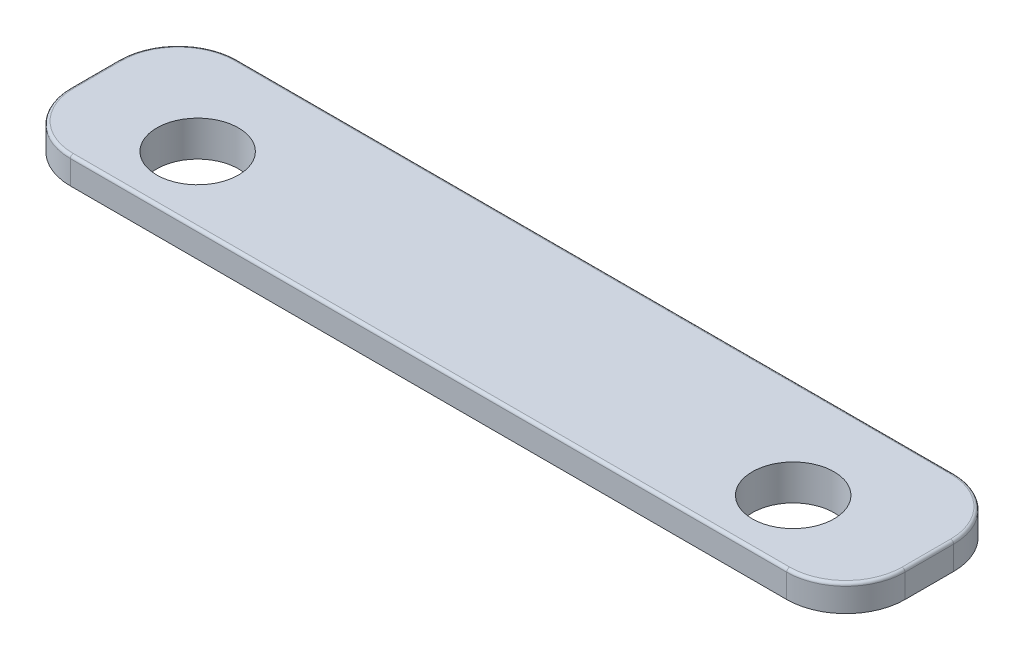
ISO-10303-21;
HEADER;
FILE_DESCRIPTION(('STEP AP214'),'2;1');
FILE_NAME('part.step','',(''),(''),'','','');
FILE_SCHEMA(('AUTOMOTIVE_DESIGN { 1 0 10303 214 1 1 1 1 }'));
ENDSEC;
DATA;
#1=APPLICATION_CONTEXT('core data for automotive mechanical design processes');
#2=APPLICATION_PROTOCOL_DEFINITION('international standard','automotive_design',2000,#1);
#3=PRODUCT_CONTEXT('',#1,'mechanical');
#4=PRODUCT('Part','Part','',(#3));
#5=PRODUCT_RELATED_PRODUCT_CATEGORY('part','',(#4));
#6=PRODUCT_DEFINITION_FORMATION('','',#4);
#7=PRODUCT_DEFINITION_CONTEXT('part definition',#1,'design');
#8=PRODUCT_DEFINITION('design','',#6,#7);
#9=PRODUCT_DEFINITION_SHAPE('','',#8);
#10=(LENGTH_UNIT() NAMED_UNIT(*) SI_UNIT(.MILLI.,.METRE.));
#11=(NAMED_UNIT(*) PLANE_ANGLE_UNIT() SI_UNIT($,.RADIAN.));
#12=(NAMED_UNIT(*) SI_UNIT($,.STERADIAN.) SOLID_ANGLE_UNIT());
#13=UNCERTAINTY_MEASURE_WITH_UNIT(LENGTH_MEASURE(1.E-05),#10,'distance_accuracy_value','');
#14=(GEOMETRIC_REPRESENTATION_CONTEXT(3) GLOBAL_UNCERTAINTY_ASSIGNED_CONTEXT((#13)) GLOBAL_UNIT_ASSIGNED_CONTEXT((#10,
#11,#12)) REPRESENTATION_CONTEXT('',''));
#15=CARTESIAN_POINT('',(0.,0.,0.));
#16=DIRECTION('',(0.,0.,1.));
#17=DIRECTION('',(1.,0.,0.));
#18=AXIS2_PLACEMENT_3D('',#15,#16,#17);
#19=CARTESIAN_POINT('',(-17.907,1.524,-3.5814));
#20=DIRECTION('',(1.,0.,0.));
#21=DIRECTION('',(0.,0.,-1.));
#22=AXIS2_PLACEMENT_3D('',#19,#20,#21);
#23=PLANE('',#22);
#24=DIRECTION('',(0.,0.,-1.));
#25=VECTOR('',#24,1.);
#26=CARTESIAN_POINT('',(-17.907,0.381,-1.0414));
#27=LINE('',#26,#25);
#28=CARTESIAN_POINT('',(-17.907,0.381,1.0414));
#29=VERTEX_POINT('',#28);
#30=CARTESIAN_POINT('',(-17.907,0.381,-1.0414));
#31=VERTEX_POINT('',#30);
#32=EDGE_CURVE('E254',#29,#31,#27,.T.);
#33=ORIENTED_EDGE('',*,*,#32,.F.);
#34=DIRECTION('',(0.,-1.,0.));
#35=VECTOR('',#34,1.);
#36=CARTESIAN_POINT('',(-17.907,1.524,1.0414));
#37=LINE('',#36,#35);
#38=CARTESIAN_POINT('',(-17.907,1.397,1.0414));
#39=VERTEX_POINT('',#38);
#40=EDGE_CURVE('E270',#29,#39,#37,.F.);
#41=ORIENTED_EDGE('',*,*,#40,.T.);
#42=DIRECTION('',(0.,0.,1.));
#43=VECTOR('',#42,1.);
#44=CARTESIAN_POINT('',(-17.907,1.397,-1.0414));
#45=LINE('',#44,#43);
#46=CARTESIAN_POINT('',(-17.907,1.397,-1.0414));
#47=VERTEX_POINT('',#46);
#48=EDGE_CURVE('E316',#39,#47,#45,.F.);
#49=ORIENTED_EDGE('',*,*,#48,.T.);
#50=DIRECTION('',(0.,-1.,0.));
#51=VECTOR('',#50,1.);
#52=CARTESIAN_POINT('',(-17.907,1.524,-1.0414));
#53=LINE('',#52,#51);
#54=EDGE_CURVE('E272',#47,#31,#53,.T.);
#55=ORIENTED_EDGE('',*,*,#54,.T.);
#56=EDGE_LOOP('',(#33,#41,#49,#55));
#57=FACE_BOUND('',#56,.T.);
#58=ADVANCED_FACE('F34',(#57),#23,.F.);
#59=CARTESIAN_POINT('',(-17.907,1.524,3.5814));
#60=DIRECTION('',(0.,0.,-1.));
#61=DIRECTION('',(-1.,0.,0.));
#62=AXIS2_PLACEMENT_3D('',#59,#60,#61);
#63=PLANE('',#62);
#64=DIRECTION('',(-1.,0.,0.));
#65=VECTOR('',#64,1.);
#66=CARTESIAN_POINT('',(-15.367,0.381,3.5814));
#67=LINE('',#66,#65);
#68=CARTESIAN_POINT('',(15.367,0.381,3.5814));
#69=VERTEX_POINT('',#68);
#70=CARTESIAN_POINT('',(-15.367,0.381,3.5814));
#71=VERTEX_POINT('',#70);
#72=EDGE_CURVE('E250',#69,#71,#67,.T.);
#73=ORIENTED_EDGE('',*,*,#72,.F.);
#74=DIRECTION('',(0.,-1.,0.));
#75=VECTOR('',#74,1.);
#76=CARTESIAN_POINT('',(15.367,1.524,3.5814));
#77=LINE('',#76,#75);
#78=CARTESIAN_POINT('',(15.367,1.397,3.5814));
#79=VERTEX_POINT('',#78);
#80=EDGE_CURVE('E281',#69,#79,#77,.F.);
#81=ORIENTED_EDGE('',*,*,#80,.T.);
#82=DIRECTION('',(1.,0.,0.));
#83=VECTOR('',#82,1.);
#84=CARTESIAN_POINT('',(-15.367,1.397,3.5814));
#85=LINE('',#84,#83);
#86=CARTESIAN_POINT('',(-15.367,1.397,3.5814));
#87=VERTEX_POINT('',#86);
#88=EDGE_CURVE('E311',#79,#87,#85,.F.);
#89=ORIENTED_EDGE('',*,*,#88,.T.);
#90=DIRECTION('',(0.,-1.,0.));
#91=VECTOR('',#90,1.);
#92=CARTESIAN_POINT('',(-15.367,1.524,3.5814));
#93=LINE('',#92,#91);
#94=EDGE_CURVE('E283',#87,#71,#93,.T.);
#95=ORIENTED_EDGE('',*,*,#94,.T.);
#96=EDGE_LOOP('',(#73,#81,#89,#95));
#97=FACE_BOUND('',#96,.T.);
#98=ADVANCED_FACE('F400',(#97),#63,.F.);
#99=CARTESIAN_POINT('',(17.907,1.524,-3.5814));
#100=DIRECTION('',(-1.,0.,0.));
#101=DIRECTION('',(0.,0.,1.));
#102=AXIS2_PLACEMENT_3D('',#99,#100,#101);
#103=PLANE('',#102);
#104=DIRECTION('',(0.,0.,1.));
#105=VECTOR('',#104,1.);
#106=CARTESIAN_POINT('',(17.907,0.381,1.0414));
#107=LINE('',#106,#105);
#108=CARTESIAN_POINT('',(17.907,0.381,-1.0414));
#109=VERTEX_POINT('',#108);
#110=CARTESIAN_POINT('',(17.907,0.381,1.0414));
#111=VERTEX_POINT('',#110);
#112=EDGE_CURVE('E59',#109,#111,#107,.T.);
#113=ORIENTED_EDGE('',*,*,#112,.F.);
#114=DIRECTION('',(0.,-1.,0.));
#115=VECTOR('',#114,1.);
#116=CARTESIAN_POINT('',(17.907,1.524,-1.0414));
#117=LINE('',#116,#115);
#118=CARTESIAN_POINT('',(17.907,1.397,-1.0414));
#119=VERTEX_POINT('',#118);
#120=EDGE_CURVE('E289',#109,#119,#117,.F.);
#121=ORIENTED_EDGE('',*,*,#120,.T.);
#122=DIRECTION('',(0.,0.,-1.));
#123=VECTOR('',#122,1.);
#124=CARTESIAN_POINT('',(17.907,1.397,1.0414));
#125=LINE('',#124,#123);
#126=CARTESIAN_POINT('',(17.907,1.397,1.0414));
#127=VERTEX_POINT('',#126);
#128=EDGE_CURVE('E11',#119,#127,#125,.F.);
#129=ORIENTED_EDGE('',*,*,#128,.T.);
#130=DIRECTION('',(0.,-1.,0.));
#131=VECTOR('',#130,1.);
#132=CARTESIAN_POINT('',(17.907,1.524,1.0414));
#133=LINE('',#132,#131);
#134=EDGE_CURVE('E286',#127,#111,#133,.T.);
#135=ORIENTED_EDGE('',*,*,#134,.T.);
#136=EDGE_LOOP('',(#113,#121,#129,#135));
#137=FACE_BOUND('',#136,.T.);
#138=ADVANCED_FACE('F412',(#137),#103,.F.);
#139=CARTESIAN_POINT('',(-17.907,1.524,-3.5814));
#140=DIRECTION('',(0.,0.,1.));
#141=DIRECTION('',(1.,0.,0.));
#142=AXIS2_PLACEMENT_3D('',#139,#140,#141);
#143=PLANE('',#142);
#144=DIRECTION('',(1.,0.,0.));
#145=VECTOR('',#144,1.);
#146=CARTESIAN_POINT('',(15.367,0.381,-3.5814));
#147=LINE('',#146,#145);
#148=CARTESIAN_POINT('',(-15.367,0.381,-3.5814));
#149=VERTEX_POINT('',#148);
#150=CARTESIAN_POINT('',(15.367,0.381,-3.5814));
#151=VERTEX_POINT('',#150);
#152=EDGE_CURVE('E258',#149,#151,#147,.T.);
#153=ORIENTED_EDGE('',*,*,#152,.F.);
#154=DIRECTION('',(0.,-1.,0.));
#155=VECTOR('',#154,1.);
#156=CARTESIAN_POINT('',(-15.367,1.524,-3.5814));
#157=LINE('',#156,#155);
#158=CARTESIAN_POINT('',(-15.367,1.397,-3.5814));
#159=VERTEX_POINT('',#158);
#160=EDGE_CURVE('E279',#149,#159,#157,.F.);
#161=ORIENTED_EDGE('',*,*,#160,.T.);
#162=DIRECTION('',(-1.,0.,0.));
#163=VECTOR('',#162,1.);
#164=CARTESIAN_POINT('',(15.367,1.397,-3.5814));
#165=LINE('',#164,#163);
#166=CARTESIAN_POINT('',(15.367,1.397,-3.5814));
#167=VERTEX_POINT('',#166);
#168=EDGE_CURVE('E321',#159,#167,#165,.F.);
#169=ORIENTED_EDGE('',*,*,#168,.T.);
#170=DIRECTION('',(0.,-1.,0.));
#171=VECTOR('',#170,1.);
#172=CARTESIAN_POINT('',(15.367,1.524,-3.5814));
#173=LINE('',#172,#171);
#174=EDGE_CURVE('E276',#167,#151,#173,.T.);
#175=ORIENTED_EDGE('',*,*,#174,.T.);
#176=EDGE_LOOP('',(#153,#161,#169,#175));
#177=FACE_BOUND('',#176,.T.);
#178=ADVANCED_FACE('F397',(#177),#143,.F.);
#179=CARTESIAN_POINT('',(0.,0.,0.));
#180=DIRECTION('',(0.,1.,0.));
#181=DIRECTION('',(0.,0.,1.));
#182=AXIS2_PLACEMENT_3D('',#179,#180,#181);
#183=PLANE('',#182);
#184=CARTESIAN_POINT('',(0.,0.,0.711199999999999));
#185=DIRECTION('',(0.,-1.,0.));
#186=DIRECTION('',(0.,0.,-1.));
#187=AXIS2_PLACEMENT_3D('',#184,#185,#186);
#188=CIRCLE('',#187,0.381);
#189=CARTESIAN_POINT('',(0.,0.,0.330199999999999));
#190=VERTEX_POINT('',#189);
#191=EDGE_CURVE('E732',#190,#190,#188,.T.);
#192=ORIENTED_EDGE('',*,*,#191,.F.);
#193=EDGE_LOOP('',(#192));
#194=FACE_BOUND('',#193,.T.);
#195=CARTESIAN_POINT('',(12.7762,0.,0.711199999999999));
#196=DIRECTION('',(0.,1.,0.));
#197=DIRECTION('',(0.,0.,1.));
#198=AXIS2_PLACEMENT_3D('',#195,#196,#197);
#199=CIRCLE('',#198,1.7526);
#200=CARTESIAN_POINT('',(12.7762,0.,2.4638));
#201=VERTEX_POINT('',#200);
#202=EDGE_CURVE('E737',#201,#201,#199,.T.);
#203=ORIENTED_EDGE('',*,*,#202,.T.);
#204=EDGE_LOOP('',(#203));
#205=FACE_BOUND('',#204,.T.);
#206=CARTESIAN_POINT('',(-12.7762,0.,0.711199999999999));
#207=DIRECTION('',(0.,1.,0.));
#208=DIRECTION('',(0.,0.,1.));
#209=AXIS2_PLACEMENT_3D('',#206,#207,#208);
#210=CIRCLE('',#209,1.7526);
#211=CARTESIAN_POINT('',(-12.7762,0.,2.4638));
#212=VERTEX_POINT('',#211);
#213=EDGE_CURVE('E204',#212,#212,#210,.T.);
#214=ORIENTED_EDGE('',*,*,#213,.T.);
#215=EDGE_LOOP('',(#214));
#216=FACE_BOUND('',#215,.T.);
#217=CARTESIAN_POINT('',(-15.367,0.,1.0414));
#218=DIRECTION('',(0.,-1.,0.));
#219=DIRECTION('',(0.,0.,-1.));
#220=AXIS2_PLACEMENT_3D('',#217,#218,#219);
#221=CIRCLE('',#220,1.905);
#222=CARTESIAN_POINT('',(-15.367,0.,2.9464));
#223=VERTEX_POINT('',#222);
#224=CARTESIAN_POINT('',(-17.272,0.,1.0414));
#225=VERTEX_POINT('',#224);
#226=EDGE_CURVE('E221',#223,#225,#221,.T.);
#227=ORIENTED_EDGE('',*,*,#226,.T.);
#228=DIRECTION('',(0.,0.,-1.));
#229=VECTOR('',#228,1.);
#230=CARTESIAN_POINT('',(-17.272,0.,-1.0414));
#231=LINE('',#230,#229);
#232=CARTESIAN_POINT('',(-17.272,0.,-1.0414));
#233=VERTEX_POINT('',#232);
#234=EDGE_CURVE('E178',#225,#233,#231,.T.);
#235=ORIENTED_EDGE('',*,*,#234,.T.);
#236=CARTESIAN_POINT('',(-15.367,0.,-1.0414));
#237=DIRECTION('',(0.,-1.,0.));
#238=DIRECTION('',(0.,0.,-1.));
#239=AXIS2_PLACEMENT_3D('',#236,#237,#238);
#240=CIRCLE('',#239,1.905);
#241=CARTESIAN_POINT('',(-15.367,0.,-2.9464));
#242=VERTEX_POINT('',#241);
#243=EDGE_CURVE('E51',#233,#242,#240,.T.);
#244=ORIENTED_EDGE('',*,*,#243,.T.);
#245=DIRECTION('',(1.,0.,0.));
#246=VECTOR('',#245,1.);
#247=CARTESIAN_POINT('',(15.367,0.,-2.9464));
#248=LINE('',#247,#246);
#249=CARTESIAN_POINT('',(15.367,0.,-2.9464));
#250=VERTEX_POINT('',#249);
#251=EDGE_CURVE('E225',#242,#250,#248,.T.);
#252=ORIENTED_EDGE('',*,*,#251,.T.);
#253=CARTESIAN_POINT('',(15.367,0.,-1.0414));
#254=DIRECTION('',(0.,-1.,0.));
#255=DIRECTION('',(0.,0.,-1.));
#256=AXIS2_PLACEMENT_3D('',#253,#254,#255);
#257=CIRCLE('',#256,1.905);
#258=CARTESIAN_POINT('',(17.272,0.,-1.0414));
#259=VERTEX_POINT('',#258);
#260=EDGE_CURVE('E228',#250,#259,#257,.T.);
#261=ORIENTED_EDGE('',*,*,#260,.T.);
#262=DIRECTION('',(0.,0.,1.));
#263=VECTOR('',#262,1.);
#264=CARTESIAN_POINT('',(17.272,0.,1.0414));
#265=LINE('',#264,#263);
#266=CARTESIAN_POINT('',(17.272,0.,1.0414));
#267=VERTEX_POINT('',#266);
#268=EDGE_CURVE('E231',#259,#267,#265,.T.);
#269=ORIENTED_EDGE('',*,*,#268,.T.);
#270=CARTESIAN_POINT('',(15.367,0.,1.0414));
#271=DIRECTION('',(0.,-1.,0.));
#272=DIRECTION('',(0.,0.,-1.));
#273=AXIS2_PLACEMENT_3D('',#270,#271,#272);
#274=CIRCLE('',#273,1.905);
#275=CARTESIAN_POINT('',(15.367,0.,2.9464));
#276=VERTEX_POINT('',#275);
#277=EDGE_CURVE('E201',#267,#276,#274,.T.);
#278=ORIENTED_EDGE('',*,*,#277,.T.);
#279=DIRECTION('',(-1.,0.,0.));
#280=VECTOR('',#279,1.);
#281=CARTESIAN_POINT('',(-15.367,0.,2.9464));
#282=LINE('',#281,#280);
#283=EDGE_CURVE('E198',#276,#223,#282,.T.);
#284=ORIENTED_EDGE('',*,*,#283,.T.);
#285=EDGE_LOOP('',(#227,#235,#244,#252,#261,#269,#278,#284));
#286=FACE_BOUND('',#285,.T.);
#287=ADVANCED_FACE('F434',(#194,#205,#216,#286),#183,.F.);
#288=CARTESIAN_POINT('',(-15.367,1.524,-1.0414));
#289=DIRECTION('',(0.,-1.,0.));
#290=DIRECTION('',(0.,0.,-1.));
#291=AXIS2_PLACEMENT_3D('',#288,#289,#290);
#292=CYLINDRICAL_SURFACE('',#291,2.54);
#293=ORIENTED_EDGE('',*,*,#160,.F.);
#294=CARTESIAN_POINT('',(-15.367,0.381,-1.0414));
#295=DIRECTION('',(0.,-1.,0.));
#296=DIRECTION('',(0.,0.,-1.));
#297=AXIS2_PLACEMENT_3D('',#294,#295,#296);
#298=CIRCLE('',#297,2.54);
#299=EDGE_CURVE('E256',#31,#149,#298,.T.);
#300=ORIENTED_EDGE('',*,*,#299,.F.);
#301=ORIENTED_EDGE('',*,*,#54,.F.);
#302=CARTESIAN_POINT('',(-15.367,1.397,-1.0414));
#303=DIRECTION('',(0.,1.,0.));
#304=DIRECTION('',(0.,0.,1.));
#305=AXIS2_PLACEMENT_3D('',#302,#303,#304);
#306=CIRCLE('',#305,2.54);
#307=EDGE_CURVE('E318',#47,#159,#306,.F.);
#308=ORIENTED_EDGE('',*,*,#307,.T.);
#309=EDGE_LOOP('',(#293,#300,#301,#308));
#310=FACE_BOUND('',#309,.T.);
#311=ADVANCED_FACE('F358',(#310),#292,.T.);
#312=CARTESIAN_POINT('',(-15.367,1.524,1.0414));
#313=DIRECTION('',(0.,-1.,0.));
#314=DIRECTION('',(0.,0.,-1.));
#315=AXIS2_PLACEMENT_3D('',#312,#313,#314);
#316=CYLINDRICAL_SURFACE('',#315,2.54);
#317=ORIENTED_EDGE('',*,*,#40,.F.);
#318=CARTESIAN_POINT('',(-15.367,0.381,1.0414));
#319=DIRECTION('',(0.,-1.,0.));
#320=DIRECTION('',(0.,0.,-1.));
#321=AXIS2_PLACEMENT_3D('',#318,#319,#320);
#322=CIRCLE('',#321,2.54);
#323=EDGE_CURVE('E252',#71,#29,#322,.T.);
#324=ORIENTED_EDGE('',*,*,#323,.F.);
#325=ORIENTED_EDGE('',*,*,#94,.F.);
#326=CARTESIAN_POINT('',(-15.367,1.397,1.0414));
#327=DIRECTION('',(0.,1.,0.));
#328=DIRECTION('',(0.,0.,1.));
#329=AXIS2_PLACEMENT_3D('',#326,#327,#328);
#330=CIRCLE('',#329,2.54);
#331=EDGE_CURVE('E313',#87,#39,#330,.F.);
#332=ORIENTED_EDGE('',*,*,#331,.T.);
#333=EDGE_LOOP('',(#317,#324,#325,#332));
#334=FACE_BOUND('',#333,.T.);
#335=ADVANCED_FACE('F367',(#334),#316,.T.);
#336=CARTESIAN_POINT('',(15.367,1.524,-1.0414));
#337=DIRECTION('',(0.,-1.,0.));
#338=DIRECTION('',(0.,0.,-1.));
#339=AXIS2_PLACEMENT_3D('',#336,#337,#338);
#340=CYLINDRICAL_SURFACE('',#339,2.54);
#341=ORIENTED_EDGE('',*,*,#120,.F.);
#342=CARTESIAN_POINT('',(15.367,0.381,-1.0414));
#343=DIRECTION('',(0.,-1.,0.));
#344=DIRECTION('',(0.,0.,-1.));
#345=AXIS2_PLACEMENT_3D('',#342,#343,#344);
#346=CIRCLE('',#345,2.54);
#347=EDGE_CURVE('E260',#151,#109,#346,.T.);
#348=ORIENTED_EDGE('',*,*,#347,.F.);
#349=ORIENTED_EDGE('',*,*,#174,.F.);
#350=CARTESIAN_POINT('',(15.367,1.397,-1.0414));
#351=DIRECTION('',(0.,1.,0.));
#352=DIRECTION('',(0.,0.,1.));
#353=AXIS2_PLACEMENT_3D('',#350,#351,#352);
#354=CIRCLE('',#353,2.54);
#355=EDGE_CURVE('E43',#167,#119,#354,.F.);
#356=ORIENTED_EDGE('',*,*,#355,.T.);
#357=EDGE_LOOP('',(#341,#348,#349,#356));
#358=FACE_BOUND('',#357,.T.);
#359=ADVANCED_FACE('F393',(#358),#340,.T.);
#360=CARTESIAN_POINT('',(15.367,1.524,1.0414));
#361=DIRECTION('',(0.,-1.,0.));
#362=DIRECTION('',(0.,0.,-1.));
#363=AXIS2_PLACEMENT_3D('',#360,#361,#362);
#364=CYLINDRICAL_SURFACE('',#363,2.54);
#365=ORIENTED_EDGE('',*,*,#80,.F.);
#366=CARTESIAN_POINT('',(15.367,0.381,1.0414));
#367=DIRECTION('',(0.,-1.,0.));
#368=DIRECTION('',(0.,0.,-1.));
#369=AXIS2_PLACEMENT_3D('',#366,#367,#368);
#370=CIRCLE('',#369,2.54);
#371=EDGE_CURVE('E237',#111,#69,#370,.T.);
#372=ORIENTED_EDGE('',*,*,#371,.F.);
#373=ORIENTED_EDGE('',*,*,#134,.F.);
#374=CARTESIAN_POINT('',(15.367,1.397,1.0414));
#375=DIRECTION('',(0.,1.,0.));
#376=DIRECTION('',(0.,0.,1.));
#377=AXIS2_PLACEMENT_3D('',#374,#375,#376);
#378=CIRCLE('',#377,2.54);
#379=EDGE_CURVE('E308',#127,#79,#378,.F.);
#380=ORIENTED_EDGE('',*,*,#379,.T.);
#381=EDGE_LOOP('',(#365,#372,#373,#380));
#382=FACE_BOUND('',#381,.T.);
#383=ADVANCED_FACE('F413',(#382),#364,.T.);
#384=CARTESIAN_POINT('',(0.,1.524,0.));
#385=DIRECTION('',(0.,1.,0.));
#386=DIRECTION('',(0.,0.,1.));
#387=AXIS2_PLACEMENT_3D('',#384,#385,#386);
#388=PLANE('',#387);
#389=CARTESIAN_POINT('',(12.7762,1.524,0.711199999999999));
#390=DIRECTION('',(0.,-1.,0.));
#391=DIRECTION('',(0.,0.,1.));
#392=AXIS2_PLACEMENT_3D('',#389,#390,#391);
#393=CIRCLE('',#392,1.7526);
#394=CARTESIAN_POINT('',(12.7762,1.524,2.4638));
#395=VERTEX_POINT('',#394);
#396=EDGE_CURVE('E263',#395,#395,#393,.T.);
#397=ORIENTED_EDGE('',*,*,#396,.T.);
#398=EDGE_LOOP('',(#397));
#399=FACE_BOUND('',#398,.T.);
#400=CARTESIAN_POINT('',(-12.7762,1.524,0.711199999999999));
#401=DIRECTION('',(0.,1.,0.));
#402=DIRECTION('',(0.,0.,1.));
#403=AXIS2_PLACEMENT_3D('',#400,#401,#402);
#404=CIRCLE('',#403,1.7526);
#405=CARTESIAN_POINT('',(-12.7762,1.524,2.4638));
#406=VERTEX_POINT('',#405);
#407=EDGE_CURVE('E266',#406,#406,#404,.T.);
#408=ORIENTED_EDGE('',*,*,#407,.F.);
#409=EDGE_LOOP('',(#408));
#410=FACE_BOUND('',#409,.T.);
#411=DIRECTION('',(1.,0.,0.));
#412=VECTOR('',#411,1.);
#413=CARTESIAN_POINT('',(15.367,1.524,3.4544));
#414=LINE('',#413,#412);
#415=CARTESIAN_POINT('',(-15.367,1.524,3.4544));
#416=VERTEX_POINT('',#415);
#417=CARTESIAN_POINT('',(15.367,1.524,3.4544));
#418=VERTEX_POINT('',#417);
#419=EDGE_CURVE('E303',#416,#418,#414,.T.);
#420=ORIENTED_EDGE('',*,*,#419,.T.);
#421=CARTESIAN_POINT('',(15.367,1.524,1.0414));
#422=DIRECTION('',(0.,1.,0.));
#423=DIRECTION('',(0.,0.,1.));
#424=AXIS2_PLACEMENT_3D('',#421,#422,#423);
#425=CIRCLE('',#424,2.413);
#426=CARTESIAN_POINT('',(17.78,1.524,1.0414));
#427=VERTEX_POINT('',#426);
#428=EDGE_CURVE('E305',#418,#427,#425,.T.);
#429=ORIENTED_EDGE('',*,*,#428,.T.);
#430=DIRECTION('',(0.,0.,-1.));
#431=VECTOR('',#430,1.);
#432=CARTESIAN_POINT('',(17.78,1.524,-1.0414));
#433=LINE('',#432,#431);
#434=CARTESIAN_POINT('',(17.78,1.524,-1.0414));
#435=VERTEX_POINT('',#434);
#436=EDGE_CURVE('E291',#427,#435,#433,.T.);
#437=ORIENTED_EDGE('',*,*,#436,.T.);
#438=CARTESIAN_POINT('',(15.367,1.524,-1.0414));
#439=DIRECTION('',(0.,1.,0.));
#440=DIRECTION('',(0.,0.,1.));
#441=AXIS2_PLACEMENT_3D('',#438,#439,#440);
#442=CIRCLE('',#441,2.413);
#443=CARTESIAN_POINT('',(15.367,1.524,-3.4544));
#444=VERTEX_POINT('',#443);
#445=EDGE_CURVE('E293',#435,#444,#442,.T.);
#446=ORIENTED_EDGE('',*,*,#445,.T.);
#447=DIRECTION('',(-1.,0.,0.));
#448=VECTOR('',#447,1.);
#449=CARTESIAN_POINT('',(-15.367,1.524,-3.4544));
#450=LINE('',#449,#448);
#451=CARTESIAN_POINT('',(-15.367,1.524,-3.4544));
#452=VERTEX_POINT('',#451);
#453=EDGE_CURVE('E295',#444,#452,#450,.T.);
#454=ORIENTED_EDGE('',*,*,#453,.T.);
#455=CARTESIAN_POINT('',(-15.367,1.524,-1.0414));
#456=DIRECTION('',(0.,1.,0.));
#457=DIRECTION('',(0.,0.,1.));
#458=AXIS2_PLACEMENT_3D('',#455,#456,#457);
#459=CIRCLE('',#458,2.413);
#460=CARTESIAN_POINT('',(-17.78,1.524,-1.0414));
#461=VERTEX_POINT('',#460);
#462=EDGE_CURVE('E297',#452,#461,#459,.T.);
#463=ORIENTED_EDGE('',*,*,#462,.T.);
#464=DIRECTION('',(0.,0.,1.));
#465=VECTOR('',#464,1.);
#466=CARTESIAN_POINT('',(-17.78,1.524,1.0414));
#467=LINE('',#466,#465);
#468=CARTESIAN_POINT('',(-17.78,1.524,1.0414));
#469=VERTEX_POINT('',#468);
#470=EDGE_CURVE('E299',#461,#469,#467,.T.);
#471=ORIENTED_EDGE('',*,*,#470,.T.);
#472=CARTESIAN_POINT('',(-15.367,1.524,1.0414));
#473=DIRECTION('',(0.,1.,0.));
#474=DIRECTION('',(0.,0.,1.));
#475=AXIS2_PLACEMENT_3D('',#472,#473,#474);
#476=CIRCLE('',#475,2.413);
#477=EDGE_CURVE('E301',#469,#416,#476,.T.);
#478=ORIENTED_EDGE('',*,*,#477,.T.);
#479=EDGE_LOOP('',(#420,#429,#437,#446,#454,#463,#471,#478));
#480=FACE_BOUND('',#479,.T.);
#481=ADVANCED_FACE('F379',(#399,#410,#480),#388,.T.);
#482=CARTESIAN_POINT('',(-15.367,1.397,-1.0414));
#483=DIRECTION('',(0.,1.,0.));
#484=DIRECTION('',(0.,0.,1.));
#485=AXIS2_PLACEMENT_3D('',#482,#483,#484);
#486=TOROIDAL_SURFACE('',#485,2.413,0.127);
#487=CARTESIAN_POINT('',(-15.367,1.397,-3.4544));
#488=DIRECTION('',(1.,0.,0.));
#489=DIRECTION('',(0.,0.,-1.));
#490=AXIS2_PLACEMENT_3D('',#487,#488,#489);
#491=CIRCLE('',#490,0.127);
#492=EDGE_CURVE('E341',#159,#452,#491,.T.);
#493=ORIENTED_EDGE('',*,*,#492,.F.);
#494=ORIENTED_EDGE('',*,*,#307,.F.);
#495=CARTESIAN_POINT('',(-17.78,1.397,-1.0414));
#496=DIRECTION('',(0.,0.,1.));
#497=DIRECTION('',(1.,0.,0.));
#498=AXIS2_PLACEMENT_3D('',#495,#496,#497);
#499=CIRCLE('',#498,0.127);
#500=EDGE_CURVE('E273',#461,#47,#499,.T.);
#501=ORIENTED_EDGE('',*,*,#500,.F.);
#502=ORIENTED_EDGE('',*,*,#462,.F.);
#503=EDGE_LOOP('',(#493,#494,#501,#502));
#504=FACE_BOUND('',#503,.T.);
#505=ADVANCED_FACE('F36',(#504),#486,.T.);
#506=CARTESIAN_POINT('',(-17.78,1.397,0.));
#507=DIRECTION('',(0.,0.,-1.));
#508=DIRECTION('',(-1.,0.,0.));
#509=AXIS2_PLACEMENT_3D('',#506,#507,#508);
#510=CYLINDRICAL_SURFACE('',#509,0.127);
#511=ORIENTED_EDGE('',*,*,#500,.T.);
#512=ORIENTED_EDGE('',*,*,#48,.F.);
#513=CARTESIAN_POINT('',(-17.78,1.397,1.0414));
#514=DIRECTION('',(0.,0.,1.));
#515=DIRECTION('',(1.,0.,0.));
#516=AXIS2_PLACEMENT_3D('',#513,#514,#515);
#517=CIRCLE('',#516,0.127);
#518=EDGE_CURVE('E338',#469,#39,#517,.T.);
#519=ORIENTED_EDGE('',*,*,#518,.F.);
#520=ORIENTED_EDGE('',*,*,#470,.F.);
#521=EDGE_LOOP('',(#511,#512,#519,#520));
#522=FACE_BOUND('',#521,.T.);
#523=ADVANCED_FACE('F348',(#522),#510,.T.);
#524=CARTESIAN_POINT('',(0.,1.397,-3.4544));
#525=DIRECTION('',(1.,0.,0.));
#526=DIRECTION('',(0.,0.,-1.));
#527=AXIS2_PLACEMENT_3D('',#524,#525,#526);
#528=CYLINDRICAL_SURFACE('',#527,0.127);
#529=ORIENTED_EDGE('',*,*,#492,.T.);
#530=ORIENTED_EDGE('',*,*,#453,.F.);
#531=CARTESIAN_POINT('',(15.367,1.397,-3.4544));
#532=DIRECTION('',(1.,0.,0.));
#533=DIRECTION('',(0.,0.,-1.));
#534=AXIS2_PLACEMENT_3D('',#531,#532,#533);
#535=CIRCLE('',#534,0.127);
#536=EDGE_CURVE('E335',#167,#444,#535,.T.);
#537=ORIENTED_EDGE('',*,*,#536,.F.);
#538=ORIENTED_EDGE('',*,*,#168,.F.);
#539=EDGE_LOOP('',(#529,#530,#537,#538));
#540=FACE_BOUND('',#539,.T.);
#541=ADVANCED_FACE('F384',(#540),#528,.T.);
#542=CARTESIAN_POINT('',(-15.367,1.397,1.0414));
#543=DIRECTION('',(0.,1.,0.));
#544=DIRECTION('',(0.,0.,1.));
#545=AXIS2_PLACEMENT_3D('',#542,#543,#544);
#546=TOROIDAL_SURFACE('',#545,2.413,0.127);
#547=ORIENTED_EDGE('',*,*,#518,.T.);
#548=ORIENTED_EDGE('',*,*,#331,.F.);
#549=CARTESIAN_POINT('',(-15.367,1.397,3.4544));
#550=DIRECTION('',(1.,0.,0.));
#551=DIRECTION('',(0.,0.,-1.));
#552=AXIS2_PLACEMENT_3D('',#549,#550,#551);
#553=CIRCLE('',#552,0.127);
#554=EDGE_CURVE('E332',#416,#87,#553,.T.);
#555=ORIENTED_EDGE('',*,*,#554,.F.);
#556=ORIENTED_EDGE('',*,*,#477,.F.);
#557=EDGE_LOOP('',(#547,#548,#555,#556));
#558=FACE_BOUND('',#557,.T.);
#559=ADVANCED_FACE('F370',(#558),#546,.T.);
#560=CARTESIAN_POINT('',(15.367,1.397,-1.0414));
#561=DIRECTION('',(0.,1.,0.));
#562=DIRECTION('',(0.,0.,1.));
#563=AXIS2_PLACEMENT_3D('',#560,#561,#562);
#564=TOROIDAL_SURFACE('',#563,2.413,0.127);
#565=ORIENTED_EDGE('',*,*,#536,.T.);
#566=ORIENTED_EDGE('',*,*,#445,.F.);
#567=CARTESIAN_POINT('',(17.78,1.397,-1.0414));
#568=DIRECTION('',(0.,0.,1.));
#569=DIRECTION('',(1.,0.,0.));
#570=AXIS2_PLACEMENT_3D('',#567,#568,#569);
#571=CIRCLE('',#570,0.127);
#572=EDGE_CURVE('E329',#119,#435,#571,.T.);
#573=ORIENTED_EDGE('',*,*,#572,.F.);
#574=ORIENTED_EDGE('',*,*,#355,.F.);
#575=EDGE_LOOP('',(#565,#566,#573,#574));
#576=FACE_BOUND('',#575,.T.);
#577=ADVANCED_FACE('F387',(#576),#564,.T.);
#578=CARTESIAN_POINT('',(0.,1.397,3.4544));
#579=DIRECTION('',(-1.,0.,0.));
#580=DIRECTION('',(0.,0.,1.));
#581=AXIS2_PLACEMENT_3D('',#578,#579,#580);
#582=CYLINDRICAL_SURFACE('',#581,0.127);
#583=ORIENTED_EDGE('',*,*,#554,.T.);
#584=ORIENTED_EDGE('',*,*,#88,.F.);
#585=CARTESIAN_POINT('',(15.367,1.397,3.4544));
#586=DIRECTION('',(1.,0.,0.));
#587=DIRECTION('',(0.,0.,-1.));
#588=AXIS2_PLACEMENT_3D('',#585,#586,#587);
#589=CIRCLE('',#588,0.127);
#590=EDGE_CURVE('E326',#418,#79,#589,.T.);
#591=ORIENTED_EDGE('',*,*,#590,.F.);
#592=ORIENTED_EDGE('',*,*,#419,.F.);
#593=EDGE_LOOP('',(#583,#584,#591,#592));
#594=FACE_BOUND('',#593,.T.);
#595=ADVANCED_FACE('F375',(#594),#582,.T.);
#596=CARTESIAN_POINT('',(17.78,1.397,0.));
#597=DIRECTION('',(0.,0.,1.));
#598=DIRECTION('',(1.,0.,0.));
#599=AXIS2_PLACEMENT_3D('',#596,#597,#598);
#600=CYLINDRICAL_SURFACE('',#599,0.127);
#601=ORIENTED_EDGE('',*,*,#572,.T.);
#602=ORIENTED_EDGE('',*,*,#436,.F.);
#603=CARTESIAN_POINT('',(17.78,1.397,1.0414));
#604=DIRECTION('',(0.,0.,1.));
#605=DIRECTION('',(1.,0.,0.));
#606=AXIS2_PLACEMENT_3D('',#603,#604,#605);
#607=CIRCLE('',#606,0.127);
#608=EDGE_CURVE('E269',#127,#427,#607,.T.);
#609=ORIENTED_EDGE('',*,*,#608,.F.);
#610=ORIENTED_EDGE('',*,*,#128,.F.);
#611=EDGE_LOOP('',(#601,#602,#609,#610));
#612=FACE_BOUND('',#611,.T.);
#613=ADVANCED_FACE('F409',(#612),#600,.T.);
#614=CARTESIAN_POINT('',(15.367,1.397,1.0414));
#615=DIRECTION('',(0.,1.,0.));
#616=DIRECTION('',(0.,0.,1.));
#617=AXIS2_PLACEMENT_3D('',#614,#615,#616);
#618=TOROIDAL_SURFACE('',#617,2.413,0.127);
#619=ORIENTED_EDGE('',*,*,#590,.T.);
#620=ORIENTED_EDGE('',*,*,#379,.F.);
#621=ORIENTED_EDGE('',*,*,#608,.T.);
#622=ORIENTED_EDGE('',*,*,#428,.F.);
#623=EDGE_LOOP('',(#619,#620,#621,#622));
#624=FACE_BOUND('',#623,.T.);
#625=ADVANCED_FACE('F405',(#624),#618,.T.);
#626=CARTESIAN_POINT('',(-12.7762,0.508,0.711199999999999));
#627=DIRECTION('',(0.,1.,0.));
#628=DIRECTION('',(0.,0.,1.));
#629=AXIS2_PLACEMENT_3D('',#626,#627,#628);
#630=CYLINDRICAL_SURFACE('',#629,1.7526);
#631=ORIENTED_EDGE('',*,*,#407,.T.);
#632=EDGE_LOOP('',(#631));
#633=FACE_BOUND('',#632,.T.);
#634=ORIENTED_EDGE('',*,*,#213,.F.);
#635=EDGE_LOOP('',(#634));
#636=FACE_BOUND('',#635,.T.);
#637=ADVANCED_FACE('F546',(#633,#636),#630,.F.);
#638=CARTESIAN_POINT('',(12.7762,0.508,0.711199999999999));
#639=DIRECTION('',(0.,1.,0.));
#640=DIRECTION('',(0.,0.,1.));
#641=AXIS2_PLACEMENT_3D('',#638,#639,#640);
#642=CYLINDRICAL_SURFACE('',#641,1.7526);
#643=ORIENTED_EDGE('',*,*,#396,.F.);
#644=EDGE_LOOP('',(#643));
#645=FACE_BOUND('',#644,.T.);
#646=ORIENTED_EDGE('',*,*,#202,.F.);
#647=EDGE_LOOP('',(#646));
#648=FACE_BOUND('',#647,.T.);
#649=ADVANCED_FACE('F461',(#645,#648),#642,.F.);
#650=CARTESIAN_POINT('',(15.367,0.381,1.0414));
#651=DIRECTION('',(0.,-1.,0.));
#652=DIRECTION('',(0.,0.,-1.));
#653=AXIS2_PLACEMENT_3D('',#650,#651,#652);
#654=PLANE('',#653);
#655=DIRECTION('',(-1.,0.,0.));
#656=VECTOR('',#655,1.);
#657=CARTESIAN_POINT('',(-15.367,0.381,2.9464));
#658=LINE('',#657,#656);
#659=CARTESIAN_POINT('',(15.367,0.381,2.9464));
#660=VERTEX_POINT('',#659);
#661=CARTESIAN_POINT('',(-15.367,0.381,2.9464));
#662=VERTEX_POINT('',#661);
#663=EDGE_CURVE('E184',#660,#662,#658,.T.);
#664=ORIENTED_EDGE('',*,*,#663,.F.);
#665=CARTESIAN_POINT('',(15.367,0.381,1.0414));
#666=DIRECTION('',(0.,-1.,0.));
#667=DIRECTION('',(0.,0.,-1.));
#668=AXIS2_PLACEMENT_3D('',#665,#666,#667);
#669=CIRCLE('',#668,1.905);
#670=CARTESIAN_POINT('',(17.272,0.381,1.0414));
#671=VERTEX_POINT('',#670);
#672=EDGE_CURVE('E217',#671,#660,#669,.T.);
#673=ORIENTED_EDGE('',*,*,#672,.F.);
#674=DIRECTION('',(0.,0.,1.));
#675=VECTOR('',#674,1.);
#676=CARTESIAN_POINT('',(17.272,0.381,1.0414));
#677=LINE('',#676,#675);
#678=CARTESIAN_POINT('',(17.272,0.381,-1.0414));
#679=VERTEX_POINT('',#678);
#680=EDGE_CURVE('E214',#679,#671,#677,.T.);
#681=ORIENTED_EDGE('',*,*,#680,.F.);
#682=CARTESIAN_POINT('',(15.367,0.381,-1.0414));
#683=DIRECTION('',(0.,-1.,0.));
#684=DIRECTION('',(0.,0.,-1.));
#685=AXIS2_PLACEMENT_3D('',#682,#683,#684);
#686=CIRCLE('',#685,1.905);
#687=CARTESIAN_POINT('',(15.367,0.381,-2.9464));
#688=VERTEX_POINT('',#687);
#689=EDGE_CURVE('E211',#688,#679,#686,.T.);
#690=ORIENTED_EDGE('',*,*,#689,.F.);
#691=DIRECTION('',(1.,0.,0.));
#692=VECTOR('',#691,1.);
#693=CARTESIAN_POINT('',(15.367,0.381,-2.9464));
#694=LINE('',#693,#692);
#695=CARTESIAN_POINT('',(-15.367,0.381,-2.9464));
#696=VERTEX_POINT('',#695);
#697=EDGE_CURVE('E208',#696,#688,#694,.T.);
#698=ORIENTED_EDGE('',*,*,#697,.F.);
#699=CARTESIAN_POINT('',(-15.367,0.381,-1.0414));
#700=DIRECTION('',(0.,-1.,0.));
#701=DIRECTION('',(0.,0.,-1.));
#702=AXIS2_PLACEMENT_3D('',#699,#700,#701);
#703=CIRCLE('',#702,1.905);
#704=CARTESIAN_POINT('',(-17.272,0.381,-1.0414));
#705=VERTEX_POINT('',#704);
#706=EDGE_CURVE('E194',#705,#696,#703,.T.);
#707=ORIENTED_EDGE('',*,*,#706,.F.);
#708=DIRECTION('',(0.,0.,-1.));
#709=VECTOR('',#708,1.);
#710=CARTESIAN_POINT('',(-17.272,0.381,-1.0414));
#711=LINE('',#710,#709);
#712=CARTESIAN_POINT('',(-17.272,0.381,1.0414));
#713=VERTEX_POINT('',#712);
#714=EDGE_CURVE('E176',#713,#705,#711,.T.);
#715=ORIENTED_EDGE('',*,*,#714,.F.);
#716=CARTESIAN_POINT('',(-15.367,0.381,1.0414));
#717=DIRECTION('',(0.,-1.,0.));
#718=DIRECTION('',(0.,0.,-1.));
#719=AXIS2_PLACEMENT_3D('',#716,#717,#718);
#720=CIRCLE('',#719,1.905);
#721=EDGE_CURVE('E190',#662,#713,#720,.T.);
#722=ORIENTED_EDGE('',*,*,#721,.F.);
#723=EDGE_LOOP('',(#664,#673,#681,#690,#698,#707,#715,#722));
#724=FACE_BOUND('',#723,.T.);
#725=ORIENTED_EDGE('',*,*,#371,.T.);
#726=ORIENTED_EDGE('',*,*,#72,.T.);
#727=ORIENTED_EDGE('',*,*,#323,.T.);
#728=ORIENTED_EDGE('',*,*,#32,.T.);
#729=ORIENTED_EDGE('',*,*,#299,.T.);
#730=ORIENTED_EDGE('',*,*,#152,.T.);
#731=ORIENTED_EDGE('',*,*,#347,.T.);
#732=ORIENTED_EDGE('',*,*,#112,.T.);
#733=EDGE_LOOP('',(#725,#726,#727,#728,#729,#730,#731,#732));
#734=FACE_BOUND('',#733,.T.);
#735=ADVANCED_FACE('F189',(#724,#734),#654,.T.);
#736=CARTESIAN_POINT('',(-15.367,0.381,1.0414));
#737=DIRECTION('',(0.,-1.,0.));
#738=DIRECTION('',(0.,0.,-1.));
#739=AXIS2_PLACEMENT_3D('',#736,#737,#738);
#740=CYLINDRICAL_SURFACE('',#739,1.905);
#741=ORIENTED_EDGE('',*,*,#226,.F.);
#742=DIRECTION('',(0.,-1.,0.));
#743=VECTOR('',#742,1.);
#744=CARTESIAN_POINT('',(-15.367,0.381,2.9464));
#745=LINE('',#744,#743);
#746=EDGE_CURVE('E197',#662,#223,#745,.T.);
#747=ORIENTED_EDGE('',*,*,#746,.F.);
#748=ORIENTED_EDGE('',*,*,#721,.T.);
#749=DIRECTION('',(0.,-1.,0.));
#750=VECTOR('',#749,1.);
#751=CARTESIAN_POINT('',(-17.272,0.381,1.0414));
#752=LINE('',#751,#750);
#753=EDGE_CURVE('E173',#713,#225,#752,.T.);
#754=ORIENTED_EDGE('',*,*,#753,.T.);
#755=EDGE_LOOP('',(#741,#747,#748,#754));
#756=FACE_BOUND('',#755,.T.);
#757=ADVANCED_FACE('F196',(#756),#740,.T.);
#758=CARTESIAN_POINT('',(-15.367,0.381,2.9464));
#759=DIRECTION('',(0.,0.,1.));
#760=DIRECTION('',(1.,0.,0.));
#761=AXIS2_PLACEMENT_3D('',#758,#759,#760);
#762=PLANE('',#761);
#763=ORIENTED_EDGE('',*,*,#283,.F.);
#764=DIRECTION('',(0.,-1.,0.));
#765=VECTOR('',#764,1.);
#766=CARTESIAN_POINT('',(15.367,0.381,2.9464));
#767=LINE('',#766,#765);
#768=EDGE_CURVE('E238',#660,#276,#767,.T.);
#769=ORIENTED_EDGE('',*,*,#768,.F.);
#770=ORIENTED_EDGE('',*,*,#663,.T.);
#771=ORIENTED_EDGE('',*,*,#746,.T.);
#772=EDGE_LOOP('',(#763,#769,#770,#771));
#773=FACE_BOUND('',#772,.T.);
#774=ADVANCED_FACE('F472',(#773),#762,.T.);
#775=CARTESIAN_POINT('',(15.367,0.381,1.0414));
#776=DIRECTION('',(0.,-1.,0.));
#777=DIRECTION('',(0.,0.,-1.));
#778=AXIS2_PLACEMENT_3D('',#775,#776,#777);
#779=CYLINDRICAL_SURFACE('',#778,1.905);
#780=ORIENTED_EDGE('',*,*,#277,.F.);
#781=DIRECTION('',(0.,-1.,0.));
#782=VECTOR('',#781,1.);
#783=CARTESIAN_POINT('',(17.272,0.381,1.0414));
#784=LINE('',#783,#782);
#785=EDGE_CURVE('E240',#671,#267,#784,.T.);
#786=ORIENTED_EDGE('',*,*,#785,.F.);
#787=ORIENTED_EDGE('',*,*,#672,.T.);
#788=ORIENTED_EDGE('',*,*,#768,.T.);
#789=EDGE_LOOP('',(#780,#786,#787,#788));
#790=FACE_BOUND('',#789,.T.);
#791=ADVANCED_FACE('F481',(#790),#779,.T.);
#792=CARTESIAN_POINT('',(17.272,0.381,1.0414));
#793=DIRECTION('',(1.,0.,0.));
#794=DIRECTION('',(0.,0.,-1.));
#795=AXIS2_PLACEMENT_3D('',#792,#793,#794);
#796=PLANE('',#795);
#797=ORIENTED_EDGE('',*,*,#268,.F.);
#798=DIRECTION('',(0.,-1.,0.));
#799=VECTOR('',#798,1.);
#800=CARTESIAN_POINT('',(17.272,0.381,-1.0414));
#801=LINE('',#800,#799);
#802=EDGE_CURVE('E242',#679,#259,#801,.T.);
#803=ORIENTED_EDGE('',*,*,#802,.F.);
#804=ORIENTED_EDGE('',*,*,#680,.T.);
#805=ORIENTED_EDGE('',*,*,#785,.T.);
#806=EDGE_LOOP('',(#797,#803,#804,#805));
#807=FACE_BOUND('',#806,.T.);
#808=ADVANCED_FACE('F491',(#807),#796,.T.);
#809=CARTESIAN_POINT('',(15.367,0.381,-1.0414));
#810=DIRECTION('',(0.,-1.,0.));
#811=DIRECTION('',(0.,0.,-1.));
#812=AXIS2_PLACEMENT_3D('',#809,#810,#811);
#813=CYLINDRICAL_SURFACE('',#812,1.905);
#814=ORIENTED_EDGE('',*,*,#260,.F.);
#815=DIRECTION('',(0.,-1.,0.));
#816=VECTOR('',#815,1.);
#817=CARTESIAN_POINT('',(15.367,0.381,-2.9464));
#818=LINE('',#817,#816);
#819=EDGE_CURVE('E244',#688,#250,#818,.T.);
#820=ORIENTED_EDGE('',*,*,#819,.F.);
#821=ORIENTED_EDGE('',*,*,#689,.T.);
#822=ORIENTED_EDGE('',*,*,#802,.T.);
#823=EDGE_LOOP('',(#814,#820,#821,#822));
#824=FACE_BOUND('',#823,.T.);
#825=ADVANCED_FACE('F501',(#824),#813,.T.);
#826=CARTESIAN_POINT('',(15.367,0.381,-2.9464));
#827=DIRECTION('',(0.,0.,-1.));
#828=DIRECTION('',(-1.,0.,0.));
#829=AXIS2_PLACEMENT_3D('',#826,#827,#828);
#830=PLANE('',#829);
#831=ORIENTED_EDGE('',*,*,#251,.F.);
#832=DIRECTION('',(0.,-1.,0.));
#833=VECTOR('',#832,1.);
#834=CARTESIAN_POINT('',(-15.367,0.381,-2.9464));
#835=LINE('',#834,#833);
#836=EDGE_CURVE('E246',#696,#242,#835,.T.);
#837=ORIENTED_EDGE('',*,*,#836,.F.);
#838=ORIENTED_EDGE('',*,*,#697,.T.);
#839=ORIENTED_EDGE('',*,*,#819,.T.);
#840=EDGE_LOOP('',(#831,#837,#838,#839));
#841=FACE_BOUND('',#840,.T.);
#842=ADVANCED_FACE('F511',(#841),#830,.T.);
#843=CARTESIAN_POINT('',(-15.367,0.381,-1.0414));
#844=DIRECTION('',(0.,-1.,0.));
#845=DIRECTION('',(0.,0.,-1.));
#846=AXIS2_PLACEMENT_3D('',#843,#844,#845);
#847=CYLINDRICAL_SURFACE('',#846,1.905);
#848=ORIENTED_EDGE('',*,*,#243,.F.);
#849=DIRECTION('',(0.,-1.,0.));
#850=VECTOR('',#849,1.);
#851=CARTESIAN_POINT('',(-17.272,0.381,-1.0414));
#852=LINE('',#851,#850);
#853=EDGE_CURVE('E183',#705,#233,#852,.T.);
#854=ORIENTED_EDGE('',*,*,#853,.F.);
#855=ORIENTED_EDGE('',*,*,#706,.T.);
#856=ORIENTED_EDGE('',*,*,#836,.T.);
#857=EDGE_LOOP('',(#848,#854,#855,#856));
#858=FACE_BOUND('',#857,.T.);
#859=ADVANCED_FACE('F521',(#858),#847,.T.);
#860=CARTESIAN_POINT('',(-17.272,0.381,-1.0414));
#861=DIRECTION('',(-1.,0.,0.));
#862=DIRECTION('',(0.,0.,1.));
#863=AXIS2_PLACEMENT_3D('',#860,#861,#862);
#864=PLANE('',#863);
#865=ORIENTED_EDGE('',*,*,#234,.F.);
#866=ORIENTED_EDGE('',*,*,#753,.F.);
#867=ORIENTED_EDGE('',*,*,#714,.T.);
#868=ORIENTED_EDGE('',*,*,#853,.T.);
#869=EDGE_LOOP('',(#865,#866,#867,#868));
#870=FACE_BOUND('',#869,.T.);
#871=ADVANCED_FACE('F175',(#870),#864,.T.);
#872=CARTESIAN_POINT('',(0.,0.127,0.711199999999999));
#873=DIRECTION('',(0.,-1.,0.));
#874=DIRECTION('',(0.,0.,-1.));
#875=AXIS2_PLACEMENT_3D('',#872,#873,#874);
#876=CYLINDRICAL_SURFACE('',#875,0.381);
#877=CARTESIAN_POINT('',(0.,0.127,0.711199999999999));
#878=DIRECTION('',(0.,-1.,0.));
#879=DIRECTION('',(0.,0.,-1.));
#880=AXIS2_PLACEMENT_3D('',#877,#878,#879);
#881=CIRCLE('',#880,0.381);
#882=CARTESIAN_POINT('',(0.,0.127,0.330199999999999));
#883=VERTEX_POINT('',#882);
#884=EDGE_CURVE('E734',#883,#883,#881,.T.);
#885=ORIENTED_EDGE('',*,*,#884,.F.);
#886=EDGE_LOOP('',(#885));
#887=FACE_BOUND('',#886,.T.);
#888=ORIENTED_EDGE('',*,*,#191,.T.);
#889=EDGE_LOOP('',(#888));
#890=FACE_BOUND('',#889,.T.);
#891=ADVANCED_FACE('F539',(#887,#890),#876,.F.);
#892=CARTESIAN_POINT('',(0.,0.127,0.711199999999999));
#893=DIRECTION('',(0.,-1.,0.));
#894=DIRECTION('',(0.,0.,-1.));
#895=AXIS2_PLACEMENT_3D('',#892,#893,#894);
#896=PLANE('',#895);
#897=CARTESIAN_POINT('',(0.,0.127,0.711199999999999));
#898=DIRECTION('',(0.,-1.,0.));
#899=DIRECTION('',(0.,0.,-1.));
#900=AXIS2_PLACEMENT_3D('',#897,#898,#899);
#901=CIRCLE('',#900,0.1905);
#902=CARTESIAN_POINT('',(0.,0.127,0.520699999999999));
#903=VERTEX_POINT('',#902);
#904=EDGE_CURVE('E38',#903,#903,#901,.T.);
#905=ORIENTED_EDGE('',*,*,#904,.F.);
#906=EDGE_LOOP('',(#905));
#907=FACE_BOUND('',#906,.T.);
#908=ORIENTED_EDGE('',*,*,#884,.T.);
#909=EDGE_LOOP('',(#908));
#910=FACE_BOUND('',#909,.T.);
#911=ADVANCED_FACE('F579',(#907,#910),#896,.T.);
#912=CARTESIAN_POINT('',(0.,0.762,0.711199999999999));
#913=DIRECTION('',(0.,-1.,0.));
#914=DIRECTION('',(0.,0.,-1.));
#915=AXIS2_PLACEMENT_3D('',#912,#913,#914);
#916=CYLINDRICAL_SURFACE('',#915,0.1905);
#917=ORIENTED_EDGE('',*,*,#904,.T.);
#918=EDGE_LOOP('',(#917));
#919=FACE_BOUND('',#918,.T.);
#920=CARTESIAN_POINT('',(0.,0.762,0.711199999999999));
#921=DIRECTION('',(0.,-1.,0.));
#922=DIRECTION('',(0.,0.,-1.));
#923=AXIS2_PLACEMENT_3D('',#920,#921,#922);
#924=CIRCLE('',#923,0.1905);
#925=CARTESIAN_POINT('',(0.,0.762,0.520699999999999));
#926=VERTEX_POINT('',#925);
#927=EDGE_CURVE('E728',#926,#926,#924,.T.);
#928=ORIENTED_EDGE('',*,*,#927,.F.);
#929=EDGE_LOOP('',(#928));
#930=FACE_BOUND('',#929,.T.);
#931=ADVANCED_FACE('F589',(#919,#930),#916,.F.);
#932=CARTESIAN_POINT('',(0.,0.762,0.711199999999999));
#933=DIRECTION('',(0.,-1.,0.));
#934=DIRECTION('',(0.,0.,-1.));
#935=AXIS2_PLACEMENT_3D('',#932,#933,#934);
#936=PLANE('',#935);
#937=ORIENTED_EDGE('',*,*,#927,.T.);
#938=EDGE_LOOP('',(#937));
#939=FACE_BOUND('',#938,.T.);
#940=ADVANCED_FACE('F599',(#939),#936,.T.);
#941=CLOSED_SHELL('',(#58,#98,#138,#178,#287,#311,#335,#359,#383,#481,#505,#523,#541,#559,#577,
#595,#613,#625,#637,#649,#735,#757,#774,#791,#808,#825,#842,#859,#871,#891,#911,#931,#940));
#942=MANIFOLD_SOLID_BREP('B2',#941);
#943=ADVANCED_BREP_SHAPE_REPRESENTATION('',(#18,#942),#14);
#944=SHAPE_DEFINITION_REPRESENTATION(#9,#943);
ENDSEC;
END-ISO-10303-21;
